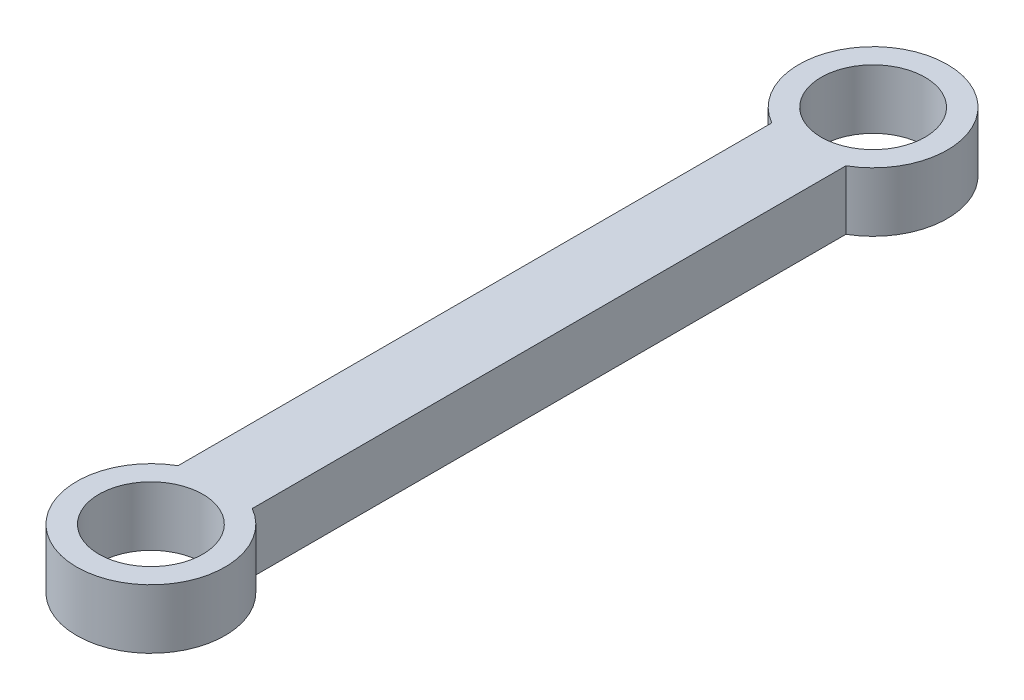
ISO-10303-21;
HEADER;
FILE_DESCRIPTION(('STEP AP214'),'2;1');
FILE_NAME('part.step','',(''),(''),'','','');
FILE_SCHEMA(('AUTOMOTIVE_DESIGN { 1 0 10303 214 1 1 1 1 }'));
ENDSEC;
DATA;
#1=APPLICATION_CONTEXT('core data for automotive mechanical design processes');
#2=APPLICATION_PROTOCOL_DEFINITION('international standard','automotive_design',2000,#1);
#3=PRODUCT_CONTEXT('',#1,'mechanical');
#4=PRODUCT('Part','Part','',(#3));
#5=PRODUCT_RELATED_PRODUCT_CATEGORY('part','',(#4));
#6=PRODUCT_DEFINITION_FORMATION('','',#4);
#7=PRODUCT_DEFINITION_CONTEXT('part definition',#1,'design');
#8=PRODUCT_DEFINITION('design','',#6,#7);
#9=PRODUCT_DEFINITION_SHAPE('','',#8);
#10=(LENGTH_UNIT() NAMED_UNIT(*) SI_UNIT(.MILLI.,.METRE.));
#11=(NAMED_UNIT(*) PLANE_ANGLE_UNIT() SI_UNIT($,.RADIAN.));
#12=(NAMED_UNIT(*) SI_UNIT($,.STERADIAN.) SOLID_ANGLE_UNIT());
#13=UNCERTAINTY_MEASURE_WITH_UNIT(LENGTH_MEASURE(1.E-05),#10,'distance_accuracy_value','');
#14=(GEOMETRIC_REPRESENTATION_CONTEXT(3) GLOBAL_UNCERTAINTY_ASSIGNED_CONTEXT((#13)) GLOBAL_UNIT_ASSIGNED_CONTEXT((#10,
#11,#12)) REPRESENTATION_CONTEXT('',''));
#15=CARTESIAN_POINT('',(0.,0.,0.));
#16=DIRECTION('',(0.,0.,1.));
#17=DIRECTION('',(1.,0.,0.));
#18=AXIS2_PLACEMENT_3D('',#15,#16,#17);
#19=CARTESIAN_POINT('',(0.,1.,-12.1650635094611));
#20=DIRECTION('',(0.,-1.,0.));
#21=DIRECTION('',(0.,0.,-1.));
#22=AXIS2_PLACEMENT_3D('',#19,#20,#21);
#23=CYLINDRICAL_SURFACE('',#22,2.5);
#24=CARTESIAN_POINT('',(0.,-1.,-12.1650635094611));
#25=DIRECTION('',(0.,1.,0.));
#26=DIRECTION('',(0.,0.,1.));
#27=AXIS2_PLACEMENT_3D('',#24,#25,#26);
#28=CIRCLE('',#27,2.5);
#29=CARTESIAN_POINT('',(-1.25,-1.,-10.));
#30=VERTEX_POINT('',#29);
#31=CARTESIAN_POINT('',(1.25,-1.,-10.));
#32=VERTEX_POINT('',#31);
#33=EDGE_CURVE('E119',#30,#32,#28,.F.);
#34=ORIENTED_EDGE('',*,*,#33,.F.);
#35=DIRECTION('',(0.,-1.,0.));
#36=VECTOR('',#35,1.);
#37=CARTESIAN_POINT('',(-1.25,1.,-10.));
#38=LINE('',#37,#36);
#39=CARTESIAN_POINT('',(-1.25,1.,-10.));
#40=VERTEX_POINT('',#39);
#41=EDGE_CURVE('E11',#40,#30,#38,.T.);
#42=ORIENTED_EDGE('',*,*,#41,.F.);
#43=CARTESIAN_POINT('',(0.,1.,-12.1650635094611));
#44=DIRECTION('',(0.,1.,0.));
#45=DIRECTION('',(0.,0.,1.));
#46=AXIS2_PLACEMENT_3D('',#43,#44,#45);
#47=CIRCLE('',#46,2.5);
#48=CARTESIAN_POINT('',(1.25,1.,-10.));
#49=VERTEX_POINT('',#48);
#50=EDGE_CURVE('E95',#40,#49,#47,.F.);
#51=ORIENTED_EDGE('',*,*,#50,.T.);
#52=DIRECTION('',(0.,-1.,0.));
#53=VECTOR('',#52,1.);
#54=CARTESIAN_POINT('',(1.25,1.,-10.));
#55=LINE('',#54,#53);
#56=EDGE_CURVE('E56',#49,#32,#55,.T.);
#57=ORIENTED_EDGE('',*,*,#56,.T.);
#58=EDGE_LOOP('',(#34,#42,#51,#57));
#59=FACE_BOUND('',#58,.T.);
#60=ADVANCED_FACE('F38',(#59),#23,.T.);
#61=CARTESIAN_POINT('',(-1.25,1.,0.));
#62=DIRECTION('',(1.,0.,0.));
#63=DIRECTION('',(0.,0.,-1.));
#64=AXIS2_PLACEMENT_3D('',#61,#62,#63);
#65=PLANE('',#64);
#66=DIRECTION('',(0.,0.,1.));
#67=VECTOR('',#66,1.);
#68=CARTESIAN_POINT('',(-1.25,-1.,0.));
#69=LINE('',#68,#67);
#70=CARTESIAN_POINT('',(-1.25,-1.,10.));
#71=VERTEX_POINT('',#70);
#72=EDGE_CURVE('E101',#30,#71,#69,.T.);
#73=ORIENTED_EDGE('',*,*,#72,.T.);
#74=DIRECTION('',(0.,-1.,0.));
#75=VECTOR('',#74,1.);
#76=CARTESIAN_POINT('',(-1.25,1.,10.));
#77=LINE('',#76,#75);
#78=CARTESIAN_POINT('',(-1.25,1.,10.));
#79=VERTEX_POINT('',#78);
#80=EDGE_CURVE('E48',#79,#71,#77,.T.);
#81=ORIENTED_EDGE('',*,*,#80,.F.);
#82=DIRECTION('',(0.,0.,1.));
#83=VECTOR('',#82,1.);
#84=CARTESIAN_POINT('',(-1.25,1.,0.));
#85=LINE('',#84,#83);
#86=EDGE_CURVE('E91',#40,#79,#85,.T.);
#87=ORIENTED_EDGE('',*,*,#86,.F.);
#88=ORIENTED_EDGE('',*,*,#41,.T.);
#89=EDGE_LOOP('',(#73,#81,#87,#88));
#90=FACE_BOUND('',#89,.T.);
#91=ADVANCED_FACE('F99',(#90),#65,.F.);
#92=CARTESIAN_POINT('',(0.,1.,12.1650635094611));
#93=DIRECTION('',(0.,-1.,0.));
#94=DIRECTION('',(0.,0.,-1.));
#95=AXIS2_PLACEMENT_3D('',#92,#93,#94);
#96=CYLINDRICAL_SURFACE('',#95,2.5);
#97=CARTESIAN_POINT('',(0.,-1.,12.1650635094611));
#98=DIRECTION('',(0.,1.,0.));
#99=DIRECTION('',(0.,0.,1.));
#100=AXIS2_PLACEMENT_3D('',#97,#98,#99);
#101=CIRCLE('',#100,2.5);
#102=CARTESIAN_POINT('',(1.25,-1.,10.));
#103=VERTEX_POINT('',#102);
#104=EDGE_CURVE('E114',#71,#103,#101,.T.);
#105=ORIENTED_EDGE('',*,*,#104,.T.);
#106=DIRECTION('',(0.,-1.,0.));
#107=VECTOR('',#106,1.);
#108=CARTESIAN_POINT('',(1.25,1.,10.));
#109=LINE('',#108,#107);
#110=CARTESIAN_POINT('',(1.25,1.,10.));
#111=VERTEX_POINT('',#110);
#112=EDGE_CURVE('E70',#111,#103,#109,.T.);
#113=ORIENTED_EDGE('',*,*,#112,.F.);
#114=CARTESIAN_POINT('',(0.,1.,12.1650635094611));
#115=DIRECTION('',(0.,1.,0.));
#116=DIRECTION('',(0.,0.,1.));
#117=AXIS2_PLACEMENT_3D('',#114,#115,#116);
#118=CIRCLE('',#117,2.5);
#119=EDGE_CURVE('E82',#79,#111,#118,.T.);
#120=ORIENTED_EDGE('',*,*,#119,.F.);
#121=ORIENTED_EDGE('',*,*,#80,.T.);
#122=EDGE_LOOP('',(#105,#113,#120,#121));
#123=FACE_BOUND('',#122,.T.);
#124=ADVANCED_FACE('F84',(#123),#96,.T.);
#125=CARTESIAN_POINT('',(0.,1.,-12.1650635094611));
#126=DIRECTION('',(0.,-1.,0.));
#127=DIRECTION('',(0.,0.,-1.));
#128=AXIS2_PLACEMENT_3D('',#125,#126,#127);
#129=CYLINDRICAL_SURFACE('',#128,1.75);
#130=CARTESIAN_POINT('',(0.,1.,-12.1650635094611));
#131=DIRECTION('',(0.,1.,0.));
#132=DIRECTION('',(0.,0.,1.));
#133=AXIS2_PLACEMENT_3D('',#130,#131,#132);
#134=CIRCLE('',#133,1.75);
#135=CARTESIAN_POINT('',(0.,1.,-10.4150635094611));
#136=VERTEX_POINT('',#135);
#137=EDGE_CURVE('E134',#136,#136,#134,.T.);
#138=ORIENTED_EDGE('',*,*,#137,.T.);
#139=EDGE_LOOP('',(#138));
#140=FACE_BOUND('',#139,.T.);
#141=CARTESIAN_POINT('',(0.,-1.,-12.1650635094611));
#142=DIRECTION('',(0.,1.,0.));
#143=DIRECTION('',(0.,0.,1.));
#144=AXIS2_PLACEMENT_3D('',#141,#142,#143);
#145=CIRCLE('',#144,1.75);
#146=CARTESIAN_POINT('',(0.,-1.,-10.4150635094611));
#147=VERTEX_POINT('',#146);
#148=EDGE_CURVE('E122',#147,#147,#145,.T.);
#149=ORIENTED_EDGE('',*,*,#148,.F.);
#150=EDGE_LOOP('',(#149));
#151=FACE_BOUND('',#150,.T.);
#152=ADVANCED_FACE('F152',(#140,#151),#129,.F.);
#153=CARTESIAN_POINT('',(0.,1.,12.1650635094611));
#154=DIRECTION('',(0.,-1.,0.));
#155=DIRECTION('',(0.,0.,-1.));
#156=AXIS2_PLACEMENT_3D('',#153,#154,#155);
#157=CYLINDRICAL_SURFACE('',#156,1.75);
#158=CARTESIAN_POINT('',(0.,1.,12.1650635094611));
#159=DIRECTION('',(0.,1.,0.));
#160=DIRECTION('',(0.,0.,1.));
#161=AXIS2_PLACEMENT_3D('',#158,#159,#160);
#162=CIRCLE('',#161,1.75);
#163=CARTESIAN_POINT('',(0.,1.,13.9150635094611));
#164=VERTEX_POINT('',#163);
#165=EDGE_CURVE('E113',#164,#164,#162,.T.);
#166=ORIENTED_EDGE('',*,*,#165,.T.);
#167=EDGE_LOOP('',(#166));
#168=FACE_BOUND('',#167,.T.);
#169=CARTESIAN_POINT('',(0.,-1.,12.1650635094611));
#170=DIRECTION('',(0.,1.,0.));
#171=DIRECTION('',(0.,0.,1.));
#172=AXIS2_PLACEMENT_3D('',#169,#170,#171);
#173=CIRCLE('',#172,1.75);
#174=CARTESIAN_POINT('',(0.,-1.,13.9150635094611));
#175=VERTEX_POINT('',#174);
#176=EDGE_CURVE('E126',#175,#175,#173,.T.);
#177=ORIENTED_EDGE('',*,*,#176,.F.);
#178=EDGE_LOOP('',(#177));
#179=FACE_BOUND('',#178,.T.);
#180=ADVANCED_FACE('F40',(#168,#179),#157,.F.);
#181=CARTESIAN_POINT('',(1.25,1.,0.));
#182=DIRECTION('',(1.,0.,0.));
#183=DIRECTION('',(0.,0.,-1.));
#184=AXIS2_PLACEMENT_3D('',#181,#182,#183);
#185=PLANE('',#184);
#186=DIRECTION('',(0.,0.,1.));
#187=VECTOR('',#186,1.);
#188=CARTESIAN_POINT('',(1.25,-1.,0.));
#189=LINE('',#188,#187);
#190=EDGE_CURVE('E109',#32,#103,#189,.T.);
#191=ORIENTED_EDGE('',*,*,#190,.F.);
#192=ORIENTED_EDGE('',*,*,#56,.F.);
#193=DIRECTION('',(0.,0.,1.));
#194=VECTOR('',#193,1.);
#195=CARTESIAN_POINT('',(1.25,1.,0.));
#196=LINE('',#195,#194);
#197=EDGE_CURVE('E90',#49,#111,#196,.T.);
#198=ORIENTED_EDGE('',*,*,#197,.T.);
#199=ORIENTED_EDGE('',*,*,#112,.T.);
#200=EDGE_LOOP('',(#191,#192,#198,#199));
#201=FACE_BOUND('',#200,.T.);
#202=ADVANCED_FACE('F148',(#201),#185,.T.);
#203=CARTESIAN_POINT('',(0.,1.,0.));
#204=DIRECTION('',(0.,1.,0.));
#205=DIRECTION('',(0.,0.,1.));
#206=AXIS2_PLACEMENT_3D('',#203,#204,#205);
#207=PLANE('',#206);
#208=ORIENTED_EDGE('',*,*,#165,.F.);
#209=EDGE_LOOP('',(#208));
#210=FACE_BOUND('',#209,.T.);
#211=ORIENTED_EDGE('',*,*,#137,.F.);
#212=EDGE_LOOP('',(#211));
#213=FACE_BOUND('',#212,.T.);
#214=ORIENTED_EDGE('',*,*,#50,.F.);
#215=ORIENTED_EDGE('',*,*,#86,.T.);
#216=ORIENTED_EDGE('',*,*,#119,.T.);
#217=ORIENTED_EDGE('',*,*,#197,.F.);
#218=EDGE_LOOP('',(#214,#215,#216,#217));
#219=FACE_BOUND('',#218,.T.);
#220=ADVANCED_FACE('F94',(#210,#213,#219),#207,.T.);
#221=CARTESIAN_POINT('',(0.,-1.,0.));
#222=DIRECTION('',(0.,1.,0.));
#223=DIRECTION('',(0.,0.,1.));
#224=AXIS2_PLACEMENT_3D('',#221,#222,#223);
#225=PLANE('',#224);
#226=ORIENTED_EDGE('',*,*,#176,.T.);
#227=EDGE_LOOP('',(#226));
#228=FACE_BOUND('',#227,.T.);
#229=ORIENTED_EDGE('',*,*,#148,.T.);
#230=EDGE_LOOP('',(#229));
#231=FACE_BOUND('',#230,.T.);
#232=ORIENTED_EDGE('',*,*,#33,.T.);
#233=ORIENTED_EDGE('',*,*,#190,.T.);
#234=ORIENTED_EDGE('',*,*,#104,.F.);
#235=ORIENTED_EDGE('',*,*,#72,.F.);
#236=EDGE_LOOP('',(#232,#233,#234,#235));
#237=FACE_BOUND('',#236,.T.);
#238=ADVANCED_FACE('F147',(#228,#231,#237),#225,.F.);
#239=CLOSED_SHELL('',(#60,#91,#124,#152,#180,#202,#220,#238));
#240=MANIFOLD_SOLID_BREP('B2',#239);
#241=ADVANCED_BREP_SHAPE_REPRESENTATION('',(#18,#240),#14);
#242=SHAPE_DEFINITION_REPRESENTATION(#9,#241);
ENDSEC;
END-ISO-10303-21;
